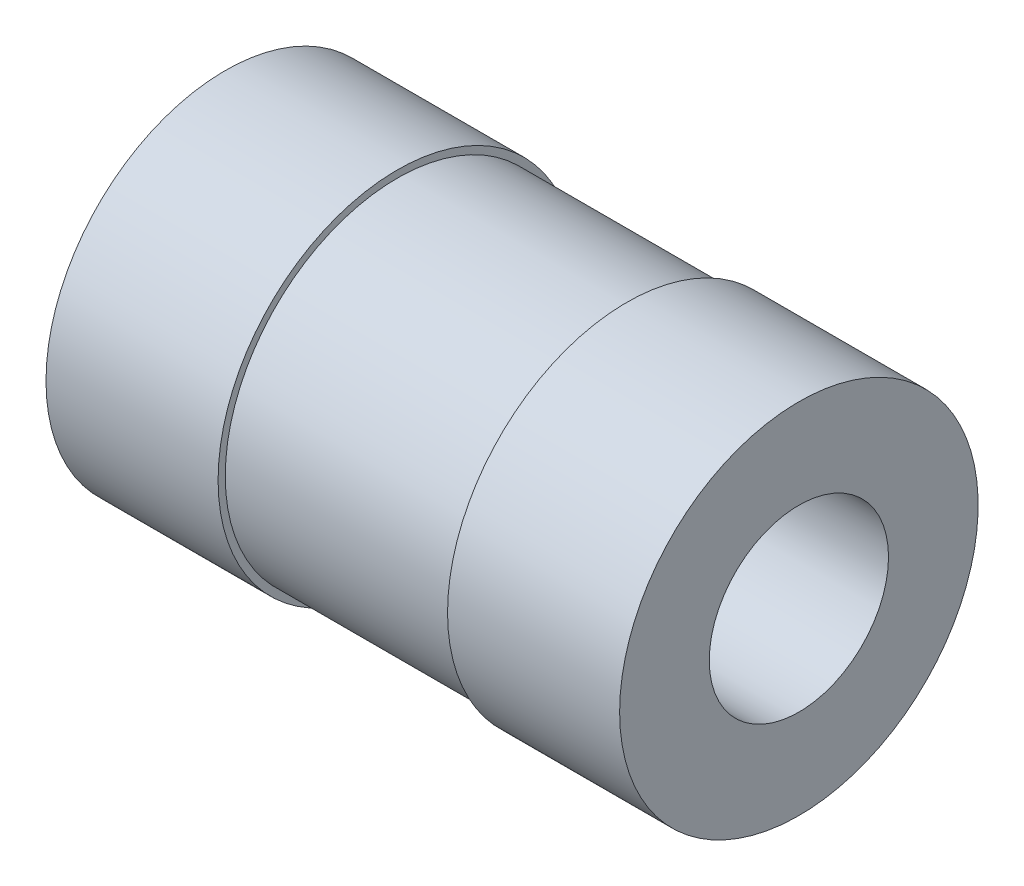
ISO-10303-21;
HEADER;
FILE_DESCRIPTION(('STEP AP214'),'2;1');
FILE_NAME('part.step','',(''),(''),'','','');
FILE_SCHEMA(('AUTOMOTIVE_DESIGN { 1 0 10303 214 1 1 1 1 }'));
ENDSEC;
DATA;
#1=APPLICATION_CONTEXT('core data for automotive mechanical design processes');
#2=APPLICATION_PROTOCOL_DEFINITION('international standard','automotive_design',2000,#1);
#3=PRODUCT_CONTEXT('',#1,'mechanical');
#4=PRODUCT('Part','Part','',(#3));
#5=PRODUCT_RELATED_PRODUCT_CATEGORY('part','',(#4));
#6=PRODUCT_DEFINITION_FORMATION('','',#4);
#7=PRODUCT_DEFINITION_CONTEXT('part definition',#1,'design');
#8=PRODUCT_DEFINITION('design','',#6,#7);
#9=PRODUCT_DEFINITION_SHAPE('','',#8);
#10=(LENGTH_UNIT() NAMED_UNIT(*) SI_UNIT(.MILLI.,.METRE.));
#11=(NAMED_UNIT(*) PLANE_ANGLE_UNIT() SI_UNIT($,.RADIAN.));
#12=(NAMED_UNIT(*) SI_UNIT($,.STERADIAN.) SOLID_ANGLE_UNIT());
#13=UNCERTAINTY_MEASURE_WITH_UNIT(LENGTH_MEASURE(1.E-05),#10,'distance_accuracy_value','');
#14=(GEOMETRIC_REPRESENTATION_CONTEXT(3) GLOBAL_UNCERTAINTY_ASSIGNED_CONTEXT((#13)) GLOBAL_UNIT_ASSIGNED_CONTEXT((#10,
#11,#12)) REPRESENTATION_CONTEXT('',''));
#15=CARTESIAN_POINT('',(0.,0.,0.));
#16=DIRECTION('',(0.,0.,1.));
#17=DIRECTION('',(1.,0.,0.));
#18=AXIS2_PLACEMENT_3D('',#15,#16,#17);
#19=CARTESIAN_POINT('',(-4.,2.5,0.));
#20=DIRECTION('',(1.,0.,0.));
#21=DIRECTION('',(0.,0.,-1.));
#22=AXIS2_PLACEMENT_3D('',#19,#20,#21);
#23=PLANE('',#22);
#24=CARTESIAN_POINT('',(-4.,0.,0.));
#25=DIRECTION('',(-1.,0.,0.));
#26=DIRECTION('',(0.,0.,1.));
#27=AXIS2_PLACEMENT_3D('',#24,#25,#26);
#28=CIRCLE('',#27,1.25);
#29=CARTESIAN_POINT('',(-4.,0.,1.25));
#30=VERTEX_POINT('',#29);
#31=EDGE_CURVE('E10',#30,#30,#28,.T.);
#32=ORIENTED_EDGE('',*,*,#31,.F.);
#33=EDGE_LOOP('',(#32));
#34=FACE_BOUND('',#33,.T.);
#35=CARTESIAN_POINT('',(-4.,0.,0.));
#36=DIRECTION('',(-1.,0.,0.));
#37=DIRECTION('',(0.,0.,1.));
#38=AXIS2_PLACEMENT_3D('',#35,#36,#37);
#39=CIRCLE('',#38,2.5);
#40=CARTESIAN_POINT('',(-4.,0.,2.5));
#41=VERTEX_POINT('',#40);
#42=EDGE_CURVE('E63',#41,#41,#39,.T.);
#43=ORIENTED_EDGE('',*,*,#42,.T.);
#44=EDGE_LOOP('',(#43));
#45=FACE_BOUND('',#44,.T.);
#46=ADVANCED_FACE('F35',(#34,#45),#23,.F.);
#47=CARTESIAN_POINT('',(-2.02262443438914,0.,0.));
#48=DIRECTION('',(-1.,0.,0.));
#49=DIRECTION('',(0.,0.,1.));
#50=AXIS2_PLACEMENT_3D('',#47,#48,#49);
#51=CYLINDRICAL_SURFACE('',#50,1.25);
#52=CARTESIAN_POINT('',(4.,0.,0.));
#53=DIRECTION('',(-1.,0.,0.));
#54=DIRECTION('',(0.,0.,1.));
#55=AXIS2_PLACEMENT_3D('',#52,#53,#54);
#56=CIRCLE('',#55,1.25);
#57=CARTESIAN_POINT('',(4.,0.,1.25));
#58=VERTEX_POINT('',#57);
#59=EDGE_CURVE('E41',#58,#58,#56,.T.);
#60=ORIENTED_EDGE('',*,*,#59,.F.);
#61=EDGE_LOOP('',(#60));
#62=FACE_BOUND('',#61,.T.);
#63=ORIENTED_EDGE('',*,*,#31,.T.);
#64=EDGE_LOOP('',(#63));
#65=FACE_BOUND('',#64,.T.);
#66=ADVANCED_FACE('F100',(#62,#65),#51,.F.);
#67=CARTESIAN_POINT('',(4.,1.25,0.));
#68=DIRECTION('',(-1.,0.,0.));
#69=DIRECTION('',(0.,0.,1.));
#70=AXIS2_PLACEMENT_3D('',#67,#68,#69);
#71=PLANE('',#70);
#72=CARTESIAN_POINT('',(4.,0.,0.));
#73=DIRECTION('',(-1.,0.,0.));
#74=DIRECTION('',(0.,0.,1.));
#75=AXIS2_PLACEMENT_3D('',#72,#73,#74);
#76=CIRCLE('',#75,2.5);
#77=CARTESIAN_POINT('',(4.,0.,2.5));
#78=VERTEX_POINT('',#77);
#79=EDGE_CURVE('E45',#78,#78,#76,.T.);
#80=ORIENTED_EDGE('',*,*,#79,.F.);
#81=EDGE_LOOP('',(#80));
#82=FACE_BOUND('',#81,.T.);
#83=ORIENTED_EDGE('',*,*,#59,.T.);
#84=EDGE_LOOP('',(#83));
#85=FACE_BOUND('',#84,.T.);
#86=ADVANCED_FACE('F95',(#82,#85),#71,.F.);
#87=CARTESIAN_POINT('',(-2.02262443438914,0.,0.));
#88=DIRECTION('',(-1.,0.,0.));
#89=DIRECTION('',(0.,0.,1.));
#90=AXIS2_PLACEMENT_3D('',#87,#88,#89);
#91=CYLINDRICAL_SURFACE('',#90,2.5);
#92=CARTESIAN_POINT('',(1.6,0.,0.));
#93=DIRECTION('',(-1.,0.,0.));
#94=DIRECTION('',(0.,0.,1.));
#95=AXIS2_PLACEMENT_3D('',#92,#93,#94);
#96=CIRCLE('',#95,2.5);
#97=CARTESIAN_POINT('',(1.6,0.,2.5));
#98=VERTEX_POINT('',#97);
#99=EDGE_CURVE('E49',#98,#98,#96,.T.);
#100=ORIENTED_EDGE('',*,*,#99,.F.);
#101=EDGE_LOOP('',(#100));
#102=FACE_BOUND('',#101,.T.);
#103=ORIENTED_EDGE('',*,*,#79,.T.);
#104=EDGE_LOOP('',(#103));
#105=FACE_BOUND('',#104,.T.);
#106=ADVANCED_FACE('F89',(#102,#105),#91,.T.);
#107=CARTESIAN_POINT('',(1.6,2.5,0.));
#108=DIRECTION('',(1.,0.,0.));
#109=DIRECTION('',(0.,0.,-1.));
#110=AXIS2_PLACEMENT_3D('',#107,#108,#109);
#111=PLANE('',#110);
#112=CARTESIAN_POINT('',(1.6,0.,0.));
#113=DIRECTION('',(-1.,0.,0.));
#114=DIRECTION('',(0.,0.,1.));
#115=AXIS2_PLACEMENT_3D('',#112,#113,#114);
#116=CIRCLE('',#115,2.4);
#117=CARTESIAN_POINT('',(1.6,0.,2.4));
#118=VERTEX_POINT('',#117);
#119=EDGE_CURVE('E54',#118,#118,#116,.T.);
#120=ORIENTED_EDGE('',*,*,#119,.F.);
#121=EDGE_LOOP('',(#120));
#122=FACE_BOUND('',#121,.T.);
#123=ORIENTED_EDGE('',*,*,#99,.T.);
#124=EDGE_LOOP('',(#123));
#125=FACE_BOUND('',#124,.T.);
#126=ADVANCED_FACE('F83',(#122,#125),#111,.F.);
#127=CARTESIAN_POINT('',(-2.02262443438914,0.,0.));
#128=DIRECTION('',(-1.,0.,0.));
#129=DIRECTION('',(0.,0.,1.));
#130=AXIS2_PLACEMENT_3D('',#127,#128,#129);
#131=CYLINDRICAL_SURFACE('',#130,2.4);
#132=CARTESIAN_POINT('',(-1.6,0.,0.));
#133=DIRECTION('',(-1.,0.,0.));
#134=DIRECTION('',(0.,0.,1.));
#135=AXIS2_PLACEMENT_3D('',#132,#133,#134);
#136=CIRCLE('',#135,2.4);
#137=CARTESIAN_POINT('',(-1.6,0.,2.4));
#138=VERTEX_POINT('',#137);
#139=EDGE_CURVE('E57',#138,#138,#136,.T.);
#140=ORIENTED_EDGE('',*,*,#139,.F.);
#141=EDGE_LOOP('',(#140));
#142=FACE_BOUND('',#141,.T.);
#143=ORIENTED_EDGE('',*,*,#119,.T.);
#144=EDGE_LOOP('',(#143));
#145=FACE_BOUND('',#144,.T.);
#146=ADVANCED_FACE('F77',(#142,#145),#131,.T.);
#147=CARTESIAN_POINT('',(-1.6,2.4,0.));
#148=DIRECTION('',(-1.,0.,0.));
#149=DIRECTION('',(0.,0.,1.));
#150=AXIS2_PLACEMENT_3D('',#147,#148,#149);
#151=PLANE('',#150);
#152=CARTESIAN_POINT('',(-1.6,0.,0.));
#153=DIRECTION('',(-1.,0.,0.));
#154=DIRECTION('',(0.,0.,1.));
#155=AXIS2_PLACEMENT_3D('',#152,#153,#154);
#156=CIRCLE('',#155,2.5);
#157=CARTESIAN_POINT('',(-1.6,0.,2.5));
#158=VERTEX_POINT('',#157);
#159=EDGE_CURVE('E60',#158,#158,#156,.T.);
#160=ORIENTED_EDGE('',*,*,#159,.F.);
#161=EDGE_LOOP('',(#160));
#162=FACE_BOUND('',#161,.T.);
#163=ORIENTED_EDGE('',*,*,#139,.T.);
#164=EDGE_LOOP('',(#163));
#165=FACE_BOUND('',#164,.T.);
#166=ADVANCED_FACE('F71',(#162,#165),#151,.F.);
#167=CARTESIAN_POINT('',(-2.02262443438914,0.,0.));
#168=DIRECTION('',(-1.,0.,0.));
#169=DIRECTION('',(0.,0.,1.));
#170=AXIS2_PLACEMENT_3D('',#167,#168,#169);
#171=CYLINDRICAL_SURFACE('',#170,2.5);
#172=ORIENTED_EDGE('',*,*,#42,.F.);
#173=EDGE_LOOP('',(#172));
#174=FACE_BOUND('',#173,.T.);
#175=ORIENTED_EDGE('',*,*,#159,.T.);
#176=EDGE_LOOP('',(#175));
#177=FACE_BOUND('',#176,.T.);
#178=ADVANCED_FACE('F68',(#174,#177),#171,.T.);
#179=CLOSED_SHELL('',(#46,#66,#86,#106,#126,#146,#166,#178));
#180=MANIFOLD_SOLID_BREP('B2',#179);
#181=ADVANCED_BREP_SHAPE_REPRESENTATION('',(#18,#180),#14);
#182=SHAPE_DEFINITION_REPRESENTATION(#9,#181);
ENDSEC;
END-ISO-10303-21;
